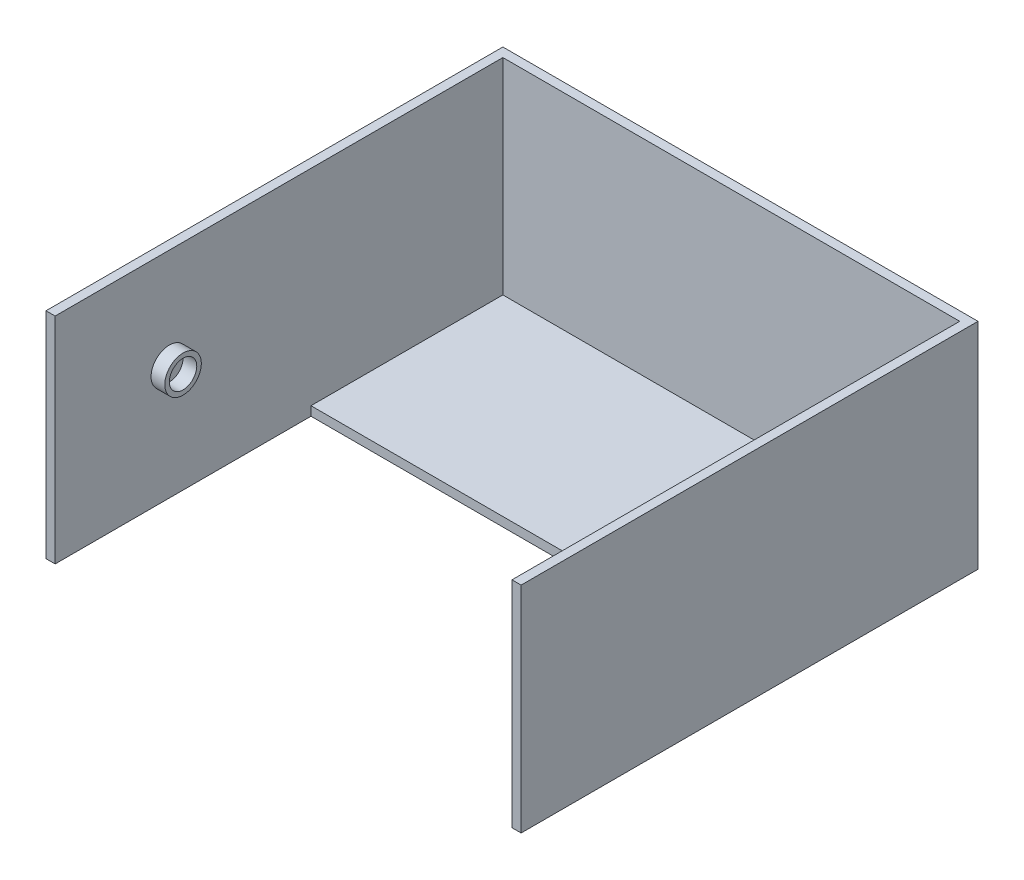
ISO-10303-21;
HEADER;
FILE_DESCRIPTION(('STEP AP214'),'2;1');
FILE_NAME('part.step','',(''),(''),'','','');
FILE_SCHEMA(('AUTOMOTIVE_DESIGN { 1 0 10303 214 1 1 1 1 }'));
ENDSEC;
DATA;
#1=APPLICATION_CONTEXT('core data for automotive mechanical design processes');
#2=APPLICATION_PROTOCOL_DEFINITION('international standard','automotive_design',2000,#1);
#3=PRODUCT_CONTEXT('',#1,'mechanical');
#4=PRODUCT('Part','Part','',(#3));
#5=PRODUCT_RELATED_PRODUCT_CATEGORY('part','',(#4));
#6=PRODUCT_DEFINITION_FORMATION('','',#4);
#7=PRODUCT_DEFINITION_CONTEXT('part definition',#1,'design');
#8=PRODUCT_DEFINITION('design','',#6,#7);
#9=PRODUCT_DEFINITION_SHAPE('','',#8);
#10=(LENGTH_UNIT() NAMED_UNIT(*) SI_UNIT(.MILLI.,.METRE.));
#11=(NAMED_UNIT(*) PLANE_ANGLE_UNIT() SI_UNIT($,.RADIAN.));
#12=(NAMED_UNIT(*) SI_UNIT($,.STERADIAN.) SOLID_ANGLE_UNIT());
#13=UNCERTAINTY_MEASURE_WITH_UNIT(LENGTH_MEASURE(1.E-05),#10,'distance_accuracy_value','');
#14=(GEOMETRIC_REPRESENTATION_CONTEXT(3) GLOBAL_UNCERTAINTY_ASSIGNED_CONTEXT((#13)) GLOBAL_UNIT_ASSIGNED_CONTEXT((#10,
#11,#12)) REPRESENTATION_CONTEXT('',''));
#15=CARTESIAN_POINT('',(0.,0.,0.));
#16=DIRECTION('',(0.,0.,1.));
#17=DIRECTION('',(1.,0.,0.));
#18=AXIS2_PLACEMENT_3D('',#15,#16,#17);
#19=CARTESIAN_POINT('',(0.,0.,0.));
#20=DIRECTION('',(0.,0.,-1.));
#21=DIRECTION('',(-1.,0.,0.));
#22=AXIS2_PLACEMENT_3D('',#19,#20,#21);
#23=PLANE('',#22);
#24=DIRECTION('',(1.,0.,0.));
#25=VECTOR('',#24,1.);
#26=CARTESIAN_POINT('',(-48.242261060692,-28.8726049347703,0.));
#27=LINE('',#26,#25);
#28=CARTESIAN_POINT('',(-48.242261060692,-28.8726049347703,0.));
#29=VERTEX_POINT('',#28);
#30=CARTESIAN_POINT('',(-46.242261060692,-28.8726049347703,0.));
#31=VERTEX_POINT('',#30);
#32=EDGE_CURVE('E151',#29,#31,#27,.T.);
#33=ORIENTED_EDGE('',*,*,#32,.T.);
#34=DIRECTION('',(0.,1.,0.));
#35=VECTOR('',#34,1.);
#36=CARTESIAN_POINT('',(-46.242261060692,18.1273950652297,0.));
#37=LINE('',#36,#35);
#38=CARTESIAN_POINT('',(-46.242261060692,18.1273950652297,0.));
#39=VERTEX_POINT('',#38);
#40=EDGE_CURVE('E134',#39,#31,#37,.F.);
#41=ORIENTED_EDGE('',*,*,#40,.F.);
#42=DIRECTION('',(1.,0.,0.));
#43=VECTOR('',#42,1.);
#44=CARTESIAN_POINT('',(-48.242261060692,18.1273950652297,0.));
#45=LINE('',#44,#43);
#46=CARTESIAN_POINT('',(-48.242261060692,18.1273950652297,0.));
#47=VERTEX_POINT('',#46);
#48=EDGE_CURVE('E146',#47,#39,#45,.T.);
#49=ORIENTED_EDGE('',*,*,#48,.F.);
#50=DIRECTION('',(0.,-1.,0.));
#51=VECTOR('',#50,1.);
#52=CARTESIAN_POINT('',(-48.242261060692,18.1273950652297,0.));
#53=LINE('',#52,#51);
#54=EDGE_CURVE('E160',#47,#29,#53,.T.);
#55=ORIENTED_EDGE('',*,*,#54,.T.);
#56=EDGE_LOOP('',(#33,#41,#49,#55));
#57=FACE_BOUND('',#56,.T.);
#58=ADVANCED_FACE('F47',(#57),#23,.F.);
#59=CARTESIAN_POINT('',(-46.242261060692,18.1273950652297,-100.));
#60=DIRECTION('',(-1.,0.,0.));
#61=DIRECTION('',(0.,0.,1.));
#62=AXIS2_PLACEMENT_3D('',#59,#60,#61);
#63=PLANE('',#62);
#64=CARTESIAN_POINT('',(-46.242261060692,-3.8726049347703,-25.));
#65=DIRECTION('',(-1.,0.,0.));
#66=DIRECTION('',(0.,0.,1.));
#67=AXIS2_PLACEMENT_3D('',#64,#65,#66);
#68=CIRCLE('',#67,4.00000000000001);
#69=CARTESIAN_POINT('',(-46.242261060692,-3.8726049347703,-21.));
#70=VERTEX_POINT('',#69);
#71=EDGE_CURVE('E55',#70,#70,#68,.F.);
#72=ORIENTED_EDGE('',*,*,#71,.F.);
#73=EDGE_LOOP('',(#72));
#74=FACE_BOUND('',#73,.T.);
#75=DIRECTION('',(0.,-1.,0.));
#76=VECTOR('',#75,1.);
#77=CARTESIAN_POINT('',(-46.242261060692,18.1273950652297,-98.));
#78=LINE('',#77,#76);
#79=CARTESIAN_POINT('',(-46.242261060692,18.1273950652297,-98.));
#80=VERTEX_POINT('',#79);
#81=CARTESIAN_POINT('',(-46.242261060692,-26.8726049347703,-98.));
#82=VERTEX_POINT('',#81);
#83=EDGE_CURVE('E247',#80,#82,#78,.T.);
#84=ORIENTED_EDGE('',*,*,#83,.F.);
#85=DIRECTION('',(0.,0.,1.));
#86=VECTOR('',#85,1.);
#87=CARTESIAN_POINT('',(-46.242261060692,18.1273950652297,-100.));
#88=LINE('',#87,#86);
#89=EDGE_CURVE('E141',#80,#39,#88,.T.);
#90=ORIENTED_EDGE('',*,*,#89,.T.);
#91=ORIENTED_EDGE('',*,*,#40,.T.);
#92=DIRECTION('',(0.,0.,1.));
#93=VECTOR('',#92,1.);
#94=CARTESIAN_POINT('',(-46.242261060692,-28.8726049347703,0.));
#95=LINE('',#94,#93);
#96=CARTESIAN_POINT('',(-46.242261060692,-28.8726049347703,-56.));
#97=VERTEX_POINT('',#96);
#98=EDGE_CURVE('E138',#97,#31,#95,.T.);
#99=ORIENTED_EDGE('',*,*,#98,.F.);
#100=DIRECTION('',(0.,1.,0.));
#101=VECTOR('',#100,1.);
#102=CARTESIAN_POINT('',(-46.242261060692,-28.8726049347703,-56.));
#103=LINE('',#102,#101);
#104=CARTESIAN_POINT('',(-46.242261060692,-26.8726049347703,-56.));
#105=VERTEX_POINT('',#104);
#106=EDGE_CURVE('E237',#97,#105,#103,.T.);
#107=ORIENTED_EDGE('',*,*,#106,.T.);
#108=DIRECTION('',(0.,0.,1.));
#109=VECTOR('',#108,1.);
#110=CARTESIAN_POINT('',(-46.242261060692,-26.8726049347703,-100.));
#111=LINE('',#110,#109);
#112=EDGE_CURVE('E173',#82,#105,#111,.T.);
#113=ORIENTED_EDGE('',*,*,#112,.F.);
#114=EDGE_LOOP('',(#84,#90,#91,#99,#107,#113));
#115=FACE_BOUND('',#114,.T.);
#116=ADVANCED_FACE('F137',(#74,#115),#63,.F.);
#117=CARTESIAN_POINT('',(-48.242261060692,-26.8726049347703,-100.));
#118=DIRECTION('',(0.,-1.,0.));
#119=DIRECTION('',(0.,0.,-1.));
#120=AXIS2_PLACEMENT_3D('',#117,#118,#119);
#121=PLANE('',#120);
#122=ORIENTED_EDGE('',*,*,#112,.T.);
#123=DIRECTION('',(-1.,0.,0.));
#124=VECTOR('',#123,1.);
#125=CARTESIAN_POINT('',(-46.242261060692,-26.8726049347703,-56.));
#126=LINE('',#125,#124);
#127=CARTESIAN_POINT('',(53.757738939308,-26.8726049347703,-56.));
#128=VERTEX_POINT('',#127);
#129=EDGE_CURVE('E156',#128,#105,#126,.T.);
#130=ORIENTED_EDGE('',*,*,#129,.F.);
#131=DIRECTION('',(0.,0.,1.));
#132=VECTOR('',#131,1.);
#133=CARTESIAN_POINT('',(53.757738939308,-26.8726049347703,-100.));
#134=LINE('',#133,#132);
#135=CARTESIAN_POINT('',(53.757738939308,-26.8726049347703,-98.));
#136=VERTEX_POINT('',#135);
#137=EDGE_CURVE('E176',#136,#128,#134,.T.);
#138=ORIENTED_EDGE('',*,*,#137,.F.);
#139=DIRECTION('',(1.,0.,0.));
#140=VECTOR('',#139,1.);
#141=CARTESIAN_POINT('',(-46.242261060692,-26.8726049347703,-98.));
#142=LINE('',#141,#140);
#143=EDGE_CURVE('E239',#82,#136,#142,.T.);
#144=ORIENTED_EDGE('',*,*,#143,.F.);
#145=EDGE_LOOP('',(#122,#130,#138,#144));
#146=FACE_BOUND('',#145,.T.);
#147=ADVANCED_FACE('F189',(#146),#121,.F.);
#148=CARTESIAN_POINT('',(53.757738939308,-28.8726049347703,-100.));
#149=DIRECTION('',(1.,0.,0.));
#150=DIRECTION('',(0.,1.,0.));
#151=AXIS2_PLACEMENT_3D('',#148,#149,#150);
#152=PLANE('',#151);
#153=CARTESIAN_POINT('',(53.757738939308,-3.8726049347703,-25.));
#154=DIRECTION('',(1.,0.,0.));
#155=DIRECTION('',(0.,0.,-1.));
#156=AXIS2_PLACEMENT_3D('',#153,#154,#155);
#157=CIRCLE('',#156,4.00000000000001);
#158=CARTESIAN_POINT('',(53.757738939308,-3.8726049347703,-29.));
#159=VERTEX_POINT('',#158);
#160=EDGE_CURVE('E226',#159,#159,#157,.T.);
#161=ORIENTED_EDGE('',*,*,#160,.T.);
#162=EDGE_LOOP('',(#161));
#163=FACE_BOUND('',#162,.T.);
#164=DIRECTION('',(0.,-1.,0.));
#165=VECTOR('',#164,1.);
#166=CARTESIAN_POINT('',(53.757738939308,18.1273950652297,-98.));
#167=LINE('',#166,#165);
#168=CARTESIAN_POINT('',(53.757738939308,18.1273950652297,-98.));
#169=VERTEX_POINT('',#168);
#170=EDGE_CURVE('E243',#169,#136,#167,.T.);
#171=ORIENTED_EDGE('',*,*,#170,.T.);
#172=ORIENTED_EDGE('',*,*,#137,.T.);
#173=DIRECTION('',(0.,1.,0.));
#174=VECTOR('',#173,1.);
#175=CARTESIAN_POINT('',(53.757738939308,-28.8726049347703,-56.));
#176=LINE('',#175,#174);
#177=CARTESIAN_POINT('',(53.757738939308,-28.8726049347703,-56.));
#178=VERTEX_POINT('',#177);
#179=EDGE_CURVE('E234',#178,#128,#176,.T.);
#180=ORIENTED_EDGE('',*,*,#179,.F.);
#181=DIRECTION('',(0.,0.,-1.));
#182=VECTOR('',#181,1.);
#183=CARTESIAN_POINT('',(53.757738939308,-28.8726049347703,0.));
#184=LINE('',#183,#182);
#185=CARTESIAN_POINT('',(53.757738939308,-28.8726049347703,0.));
#186=VERTEX_POINT('',#185);
#187=EDGE_CURVE('E155',#186,#178,#184,.T.);
#188=ORIENTED_EDGE('',*,*,#187,.F.);
#189=DIRECTION('',(0.,1.,0.));
#190=VECTOR('',#189,1.);
#191=CARTESIAN_POINT('',(53.757738939308,-28.8726049347703,0.));
#192=LINE('',#191,#190);
#193=CARTESIAN_POINT('',(53.757738939308,18.1273950652297,0.));
#194=VERTEX_POINT('',#193);
#195=EDGE_CURVE('E62',#186,#194,#192,.T.);
#196=ORIENTED_EDGE('',*,*,#195,.T.);
#197=DIRECTION('',(0.,0.,1.));
#198=VECTOR('',#197,1.);
#199=CARTESIAN_POINT('',(53.757738939308,18.1273950652297,-100.));
#200=LINE('',#199,#198);
#201=EDGE_CURVE('E179',#169,#194,#200,.T.);
#202=ORIENTED_EDGE('',*,*,#201,.F.);
#203=EDGE_LOOP('',(#171,#172,#180,#188,#196,#202));
#204=FACE_BOUND('',#203,.T.);
#205=ADVANCED_FACE('F196',(#163,#204),#152,.F.);
#206=CARTESIAN_POINT('',(55.757738939308,-28.8726049347703,-100.));
#207=DIRECTION('',(1.,0.,0.));
#208=DIRECTION('',(0.,1.,0.));
#209=AXIS2_PLACEMENT_3D('',#206,#207,#208);
#210=PLANE('',#209);
#211=DIRECTION('',(0.,1.,0.));
#212=VECTOR('',#211,1.);
#213=CARTESIAN_POINT('',(55.757738939308,-28.8726049347703,0.));
#214=LINE('',#213,#212);
#215=CARTESIAN_POINT('',(55.757738939308,-28.8726049347703,0.));
#216=VERTEX_POINT('',#215);
#217=CARTESIAN_POINT('',(55.757738939308,18.1273950652297,0.));
#218=VERTEX_POINT('',#217);
#219=EDGE_CURVE('E248',#216,#218,#214,.T.);
#220=ORIENTED_EDGE('',*,*,#219,.F.);
#221=DIRECTION('',(0.,0.,1.));
#222=VECTOR('',#221,1.);
#223=CARTESIAN_POINT('',(55.757738939308,-28.8726049347703,-100.));
#224=LINE('',#223,#222);
#225=CARTESIAN_POINT('',(55.757738939308,-28.8726049347703,-100.));
#226=VERTEX_POINT('',#225);
#227=EDGE_CURVE('E71',#226,#216,#224,.T.);
#228=ORIENTED_EDGE('',*,*,#227,.F.);
#229=DIRECTION('',(0.,1.,0.));
#230=VECTOR('',#229,1.);
#231=CARTESIAN_POINT('',(55.757738939308,-28.8726049347703,-100.));
#232=LINE('',#231,#230);
#233=CARTESIAN_POINT('',(55.757738939308,18.1273950652297,-100.));
#234=VERTEX_POINT('',#233);
#235=EDGE_CURVE('E161',#226,#234,#232,.T.);
#236=ORIENTED_EDGE('',*,*,#235,.T.);
#237=DIRECTION('',(0.,0.,1.));
#238=VECTOR('',#237,1.);
#239=CARTESIAN_POINT('',(55.757738939308,18.1273950652297,-100.));
#240=LINE('',#239,#238);
#241=EDGE_CURVE('E181',#234,#218,#240,.T.);
#242=ORIENTED_EDGE('',*,*,#241,.T.);
#243=EDGE_LOOP('',(#220,#228,#236,#242));
#244=FACE_BOUND('',#243,.T.);
#245=ADVANCED_FACE('F49',(#244),#210,.T.);
#246=CARTESIAN_POINT('',(-48.242261060692,-28.8726049347703,-100.));
#247=DIRECTION('',(0.,-1.,0.));
#248=DIRECTION('',(0.,0.,-1.));
#249=AXIS2_PLACEMENT_3D('',#246,#247,#248);
#250=PLANE('',#249);
#251=ORIENTED_EDGE('',*,*,#98,.T.);
#252=ORIENTED_EDGE('',*,*,#32,.F.);
#253=DIRECTION('',(0.,0.,1.));
#254=VECTOR('',#253,1.);
#255=CARTESIAN_POINT('',(-48.242261060692,-28.8726049347703,-100.));
#256=LINE('',#255,#254);
#257=CARTESIAN_POINT('',(-48.242261060692,-28.8726049347703,-100.));
#258=VERTEX_POINT('',#257);
#259=EDGE_CURVE('E168',#258,#29,#256,.T.);
#260=ORIENTED_EDGE('',*,*,#259,.F.);
#261=DIRECTION('',(1.,0.,0.));
#262=VECTOR('',#261,1.);
#263=CARTESIAN_POINT('',(-48.242261060692,-28.8726049347703,-100.));
#264=LINE('',#263,#262);
#265=EDGE_CURVE('E182',#258,#226,#264,.T.);
#266=ORIENTED_EDGE('',*,*,#265,.T.);
#267=ORIENTED_EDGE('',*,*,#227,.T.);
#268=EDGE_CURVE('E97',#186,#216,#27,.T.);
#269=ORIENTED_EDGE('',*,*,#268,.F.);
#270=ORIENTED_EDGE('',*,*,#187,.T.);
#271=DIRECTION('',(-1.,0.,0.));
#272=VECTOR('',#271,1.);
#273=CARTESIAN_POINT('',(-46.242261060692,-28.8726049347703,-56.));
#274=LINE('',#273,#272);
#275=EDGE_CURVE('E154',#178,#97,#274,.T.);
#276=ORIENTED_EDGE('',*,*,#275,.T.);
#277=EDGE_LOOP('',(#251,#252,#260,#266,#267,#269,#270,#276));
#278=FACE_BOUND('',#277,.T.);
#279=ADVANCED_FACE('F150',(#278),#250,.T.);
#280=CARTESIAN_POINT('',(-48.242261060692,18.1273950652297,-100.));
#281=DIRECTION('',(-1.,0.,0.));
#282=DIRECTION('',(0.,0.,1.));
#283=AXIS2_PLACEMENT_3D('',#280,#281,#282);
#284=PLANE('',#283);
#285=ORIENTED_EDGE('',*,*,#54,.F.);
#286=DIRECTION('',(0.,0.,1.));
#287=VECTOR('',#286,1.);
#288=CARTESIAN_POINT('',(-48.242261060692,18.1273950652297,-100.));
#289=LINE('',#288,#287);
#290=CARTESIAN_POINT('',(-48.242261060692,18.1273950652297,-100.));
#291=VERTEX_POINT('',#290);
#292=EDGE_CURVE('E170',#291,#47,#289,.T.);
#293=ORIENTED_EDGE('',*,*,#292,.F.);
#294=DIRECTION('',(0.,-1.,0.));
#295=VECTOR('',#294,1.);
#296=CARTESIAN_POINT('',(-48.242261060692,18.1273950652297,-100.));
#297=LINE('',#296,#295);
#298=EDGE_CURVE('E251',#291,#258,#297,.T.);
#299=ORIENTED_EDGE('',*,*,#298,.T.);
#300=ORIENTED_EDGE('',*,*,#259,.T.);
#301=EDGE_LOOP('',(#285,#293,#299,#300));
#302=FACE_BOUND('',#301,.T.);
#303=ADVANCED_FACE('F264',(#302),#284,.T.);
#304=CARTESIAN_POINT('',(-48.242261060692,18.1273950652297,-100.));
#305=DIRECTION('',(0.,-1.,0.));
#306=DIRECTION('',(0.,0.,-1.));
#307=AXIS2_PLACEMENT_3D('',#304,#305,#306);
#308=PLANE('',#307);
#309=ORIENTED_EDGE('',*,*,#48,.T.);
#310=ORIENTED_EDGE('',*,*,#89,.F.);
#311=DIRECTION('',(1.,0.,0.));
#312=VECTOR('',#311,1.);
#313=CARTESIAN_POINT('',(-46.242261060692,18.1273950652297,-98.));
#314=LINE('',#313,#312);
#315=EDGE_CURVE('E241',#80,#169,#314,.T.);
#316=ORIENTED_EDGE('',*,*,#315,.T.);
#317=ORIENTED_EDGE('',*,*,#201,.T.);
#318=DIRECTION('',(1.,0.,0.));
#319=VECTOR('',#318,1.);
#320=CARTESIAN_POINT('',(53.757738939308,18.1273950652297,0.));
#321=LINE('',#320,#319);
#322=EDGE_CURVE('E257',#194,#218,#321,.T.);
#323=ORIENTED_EDGE('',*,*,#322,.T.);
#324=ORIENTED_EDGE('',*,*,#241,.F.);
#325=DIRECTION('',(1.,0.,0.));
#326=VECTOR('',#325,1.);
#327=CARTESIAN_POINT('',(53.757738939308,18.1273950652297,-100.));
#328=LINE('',#327,#326);
#329=EDGE_CURVE('E103',#291,#234,#328,.T.);
#330=ORIENTED_EDGE('',*,*,#329,.F.);
#331=ORIENTED_EDGE('',*,*,#292,.T.);
#332=EDGE_LOOP('',(#309,#310,#316,#317,#323,#324,#330,#331));
#333=FACE_BOUND('',#332,.T.);
#334=ADVANCED_FACE('F261',(#333),#308,.F.);
#335=CARTESIAN_POINT('',(0.,0.,-100.));
#336=DIRECTION('',(0.,0.,-1.));
#337=DIRECTION('',(-1.,0.,0.));
#338=AXIS2_PLACEMENT_3D('',#335,#336,#337);
#339=PLANE('',#338);
#340=ORIENTED_EDGE('',*,*,#298,.F.);
#341=ORIENTED_EDGE('',*,*,#329,.T.);
#342=ORIENTED_EDGE('',*,*,#235,.F.);
#343=ORIENTED_EDGE('',*,*,#265,.F.);
#344=EDGE_LOOP('',(#340,#341,#342,#343));
#345=FACE_BOUND('',#344,.T.);
#346=ADVANCED_FACE('F266',(#345),#339,.T.);
#347=ORIENTED_EDGE('',*,*,#195,.F.);
#348=ORIENTED_EDGE('',*,*,#268,.T.);
#349=ORIENTED_EDGE('',*,*,#219,.T.);
#350=ORIENTED_EDGE('',*,*,#322,.F.);
#351=EDGE_LOOP('',(#347,#348,#349,#350));
#352=FACE_BOUND('',#351,.T.);
#353=ADVANCED_FACE('F200',(#352),#23,.F.);
#354=CARTESIAN_POINT('',(-46.242261060692,18.1273950652297,-98.));
#355=DIRECTION('',(0.,0.,-1.));
#356=DIRECTION('',(-1.,0.,0.));
#357=AXIS2_PLACEMENT_3D('',#354,#355,#356);
#358=PLANE('',#357);
#359=ORIENTED_EDGE('',*,*,#143,.T.);
#360=ORIENTED_EDGE('',*,*,#170,.F.);
#361=ORIENTED_EDGE('',*,*,#315,.F.);
#362=ORIENTED_EDGE('',*,*,#83,.T.);
#363=EDGE_LOOP('',(#359,#360,#361,#362));
#364=FACE_BOUND('',#363,.T.);
#365=ADVANCED_FACE('F269',(#364),#358,.F.);
#366=CARTESIAN_POINT('',(-46.242261060692,-28.8726049347703,-56.));
#367=DIRECTION('',(0.,0.,-1.));
#368=DIRECTION('',(-1.,0.,0.));
#369=AXIS2_PLACEMENT_3D('',#366,#367,#368);
#370=PLANE('',#369);
#371=ORIENTED_EDGE('',*,*,#129,.T.);
#372=ORIENTED_EDGE('',*,*,#106,.F.);
#373=ORIENTED_EDGE('',*,*,#275,.F.);
#374=ORIENTED_EDGE('',*,*,#179,.T.);
#375=EDGE_LOOP('',(#371,#372,#373,#374));
#376=FACE_BOUND('',#375,.T.);
#377=ADVANCED_FACE('F274',(#376),#370,.F.);
#378=CARTESIAN_POINT('',(-43.242261060692,-3.8726049347703,-25.));
#379=DIRECTION('',(1.,0.,0.));
#380=DIRECTION('',(0.,0.,-1.));
#381=AXIS2_PLACEMENT_3D('',#378,#379,#380);
#382=PLANE('',#381);
#383=CARTESIAN_POINT('',(-43.242261060692,-3.8726049347703,-25.));
#384=DIRECTION('',(1.,0.,0.));
#385=DIRECTION('',(0.,0.,-1.));
#386=AXIS2_PLACEMENT_3D('',#383,#384,#385);
#387=CIRCLE('',#386,4.00000000000001);
#388=CARTESIAN_POINT('',(-43.242261060692,-3.8726049347703,-29.));
#389=VERTEX_POINT('',#388);
#390=EDGE_CURVE('E223',#389,#389,#387,.T.);
#391=ORIENTED_EDGE('',*,*,#390,.T.);
#392=EDGE_LOOP('',(#391));
#393=FACE_BOUND('',#392,.T.);
#394=CARTESIAN_POINT('',(-43.242261060692,-3.8726049347703,-25.));
#395=DIRECTION('',(1.,0.,0.));
#396=DIRECTION('',(0.,0.,-1.));
#397=AXIS2_PLACEMENT_3D('',#394,#395,#396);
#398=CIRCLE('',#397,3.00000000000001);
#399=CARTESIAN_POINT('',(-43.242261060692,-3.8726049347703,-28.));
#400=VERTEX_POINT('',#399);
#401=EDGE_CURVE('E219',#400,#400,#398,.T.);
#402=ORIENTED_EDGE('',*,*,#401,.F.);
#403=EDGE_LOOP('',(#402));
#404=FACE_BOUND('',#403,.T.);
#405=ADVANCED_FACE('F335',(#393,#404),#382,.T.);
#406=CARTESIAN_POINT('',(-43.242261060692,-3.8726049347703,-25.));
#407=DIRECTION('',(-1.,0.,0.));
#408=DIRECTION('',(0.,0.,1.));
#409=AXIS2_PLACEMENT_3D('',#406,#407,#408);
#410=CYLINDRICAL_SURFACE('',#409,4.00000000000001);
#411=ORIENTED_EDGE('',*,*,#390,.F.);
#412=EDGE_LOOP('',(#411));
#413=FACE_BOUND('',#412,.T.);
#414=ORIENTED_EDGE('',*,*,#71,.T.);
#415=EDGE_LOOP('',(#414));
#416=FACE_BOUND('',#415,.T.);
#417=ADVANCED_FACE('F186',(#413,#416),#410,.T.);
#418=CARTESIAN_POINT('',(-43.242261060692,-3.8726049347703,-25.));
#419=DIRECTION('',(-1.,0.,0.));
#420=DIRECTION('',(0.,0.,1.));
#421=AXIS2_PLACEMENT_3D('',#418,#419,#420);
#422=CYLINDRICAL_SURFACE('',#421,3.00000000000001);
#423=ORIENTED_EDGE('',*,*,#401,.T.);
#424=EDGE_LOOP('',(#423));
#425=FACE_BOUND('',#424,.T.);
#426=CARTESIAN_POINT('',(-46.242261060692,-3.8726049347703,-25.));
#427=DIRECTION('',(1.,0.,0.));
#428=DIRECTION('',(0.,0.,-1.));
#429=AXIS2_PLACEMENT_3D('',#426,#427,#428);
#430=CIRCLE('',#429,3.00000000000001);
#431=CARTESIAN_POINT('',(-46.242261060692,-3.8726049347703,-28.));
#432=VERTEX_POINT('',#431);
#433=EDGE_CURVE('E217',#432,#432,#430,.T.);
#434=ORIENTED_EDGE('',*,*,#433,.F.);
#435=EDGE_LOOP('',(#434));
#436=FACE_BOUND('',#435,.T.);
#437=ADVANCED_FACE('F204',(#425,#436),#422,.F.);
#438=ORIENTED_EDGE('',*,*,#433,.T.);
#439=EDGE_LOOP('',(#438));
#440=FACE_BOUND('',#439,.T.);
#441=ADVANCED_FACE('F191',(#440),#63,.F.);
#442=CARTESIAN_POINT('',(50.757738939308,-3.8726049347703,-25.));
#443=DIRECTION('',(1.,0.,0.));
#444=DIRECTION('',(0.,0.,-1.));
#445=AXIS2_PLACEMENT_3D('',#442,#443,#444);
#446=CYLINDRICAL_SURFACE('',#445,4.00000000000001);
#447=CARTESIAN_POINT('',(50.757738939308,-3.8726049347703,-25.));
#448=DIRECTION('',(1.,0.,0.));
#449=DIRECTION('',(0.,0.,-1.));
#450=AXIS2_PLACEMENT_3D('',#447,#448,#449);
#451=CIRCLE('',#450,4.00000000000001);
#452=CARTESIAN_POINT('',(50.757738939308,-3.8726049347703,-29.));
#453=VERTEX_POINT('',#452);
#454=EDGE_CURVE('E220',#453,#453,#451,.T.);
#455=ORIENTED_EDGE('',*,*,#454,.T.);
#456=EDGE_LOOP('',(#455));
#457=FACE_BOUND('',#456,.T.);
#458=ORIENTED_EDGE('',*,*,#160,.F.);
#459=EDGE_LOOP('',(#458));
#460=FACE_BOUND('',#459,.T.);
#461=ADVANCED_FACE('F203',(#457,#460),#446,.T.);
#462=CARTESIAN_POINT('',(50.757738939308,-3.8726049347703,-25.));
#463=DIRECTION('',(1.,0.,0.));
#464=DIRECTION('',(0.,0.,-1.));
#465=AXIS2_PLACEMENT_3D('',#462,#463,#464);
#466=PLANE('',#465);
#467=CARTESIAN_POINT('',(50.757738939308,-3.8726049347703,-25.));
#468=DIRECTION('',(1.,0.,0.));
#469=DIRECTION('',(0.,0.,-1.));
#470=AXIS2_PLACEMENT_3D('',#467,#468,#469);
#471=CIRCLE('',#470,3.00000000000001);
#472=CARTESIAN_POINT('',(50.757738939308,-3.8726049347703,-28.));
#473=VERTEX_POINT('',#472);
#474=EDGE_CURVE('E421',#473,#473,#471,.T.);
#475=ORIENTED_EDGE('',*,*,#474,.T.);
#476=EDGE_LOOP('',(#475));
#477=FACE_BOUND('',#476,.T.);
#478=ORIENTED_EDGE('',*,*,#454,.F.);
#479=EDGE_LOOP('',(#478));
#480=FACE_BOUND('',#479,.T.);
#481=ADVANCED_FACE('F210',(#477,#480),#466,.F.);
#482=CARTESIAN_POINT('',(50.757738939308,-3.8726049347703,-25.));
#483=DIRECTION('',(1.,0.,0.));
#484=DIRECTION('',(0.,0.,-1.));
#485=AXIS2_PLACEMENT_3D('',#482,#483,#484);
#486=CYLINDRICAL_SURFACE('',#485,3.00000000000001);
#487=ORIENTED_EDGE('',*,*,#474,.F.);
#488=EDGE_LOOP('',(#487));
#489=FACE_BOUND('',#488,.T.);
#490=CARTESIAN_POINT('',(53.757738939308,-3.8726049347703,-25.));
#491=DIRECTION('',(1.,0.,0.));
#492=DIRECTION('',(0.,1.,0.));
#493=AXIS2_PLACEMENT_3D('',#490,#491,#492);
#494=CIRCLE('',#493,3.00000000000001);
#495=CARTESIAN_POINT('',(53.757738939308,-0.872604934770291,-25.));
#496=VERTEX_POINT('',#495);
#497=EDGE_CURVE('E12',#496,#496,#494,.T.);
#498=ORIENTED_EDGE('',*,*,#497,.T.);
#499=EDGE_LOOP('',(#498));
#500=FACE_BOUND('',#499,.T.);
#501=ADVANCED_FACE('F394',(#489,#500),#486,.F.);
#502=ORIENTED_EDGE('',*,*,#497,.F.);
#503=EDGE_LOOP('',(#502));
#504=FACE_BOUND('',#503,.T.);
#505=ADVANCED_FACE('F379',(#504),#152,.F.);
#506=CLOSED_SHELL('',(#58,#116,#147,#205,#245,#279,#303,#334,#346,#353,#365,#377,#405,#417,#437,
#441,#461,#481,#501,#505));
#507=MANIFOLD_SOLID_BREP('B2',#506);
#508=ADVANCED_BREP_SHAPE_REPRESENTATION('',(#18,#507),#14);
#509=SHAPE_DEFINITION_REPRESENTATION(#9,#508);
ENDSEC;
END-ISO-10303-21;
